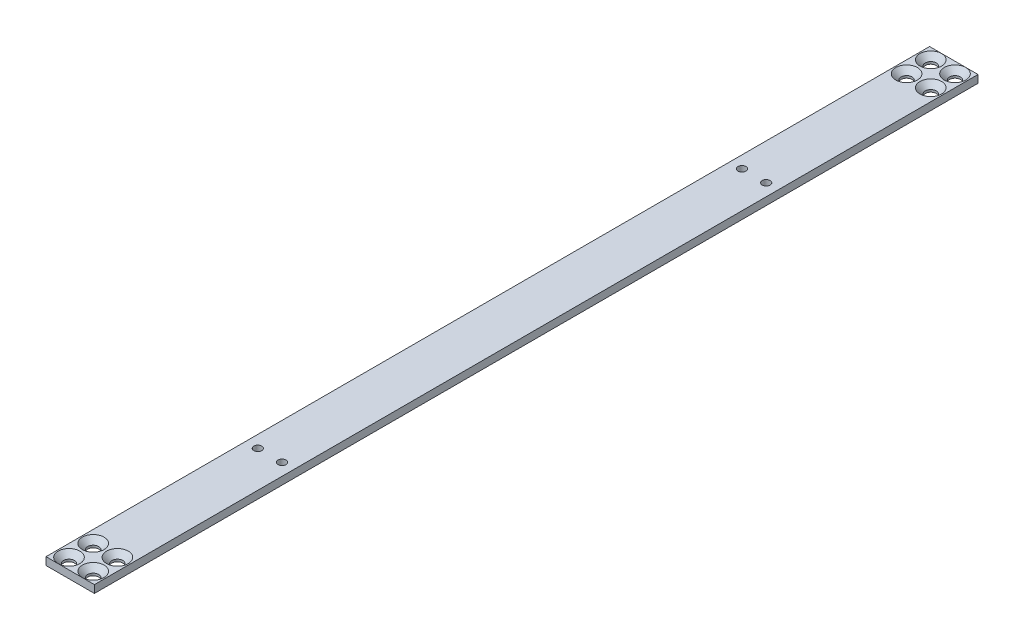
ISO-10303-21;
HEADER;
FILE_DESCRIPTION(('STEP AP214'),'2;1');
FILE_NAME('part.step','',(''),(''),'','','');
FILE_SCHEMA(('AUTOMOTIVE_DESIGN { 1 0 10303 214 1 1 1 1 }'));
ENDSEC;
DATA;
#1=APPLICATION_CONTEXT('core data for automotive mechanical design processes');
#2=APPLICATION_PROTOCOL_DEFINITION('international standard','automotive_design',2000,#1);
#3=PRODUCT_CONTEXT('',#1,'mechanical');
#4=PRODUCT('Part','Part','',(#3));
#5=PRODUCT_RELATED_PRODUCT_CATEGORY('part','',(#4));
#6=PRODUCT_DEFINITION_FORMATION('','',#4);
#7=PRODUCT_DEFINITION_CONTEXT('part definition',#1,'design');
#8=PRODUCT_DEFINITION('design','',#6,#7);
#9=PRODUCT_DEFINITION_SHAPE('','',#8);
#10=(LENGTH_UNIT() NAMED_UNIT(*) SI_UNIT(.MILLI.,.METRE.));
#11=(NAMED_UNIT(*) PLANE_ANGLE_UNIT() SI_UNIT($,.RADIAN.));
#12=(NAMED_UNIT(*) SI_UNIT($,.STERADIAN.) SOLID_ANGLE_UNIT());
#13=UNCERTAINTY_MEASURE_WITH_UNIT(LENGTH_MEASURE(1.E-05),#10,'distance_accuracy_value','');
#14=(GEOMETRIC_REPRESENTATION_CONTEXT(3) GLOBAL_UNCERTAINTY_ASSIGNED_CONTEXT((#13)) GLOBAL_UNIT_ASSIGNED_CONTEXT((#10,
#11,#12)) REPRESENTATION_CONTEXT('',''));
#15=CARTESIAN_POINT('',(0.,0.,0.));
#16=DIRECTION('',(0.,0.,1.));
#17=DIRECTION('',(1.,0.,0.));
#18=AXIS2_PLACEMENT_3D('',#15,#16,#17);
#19=CARTESIAN_POINT('',(10.,3.175,182.5));
#20=DIRECTION('',(-1.,0.,0.));
#21=DIRECTION('',(0.,0.,1.));
#22=AXIS2_PLACEMENT_3D('',#19,#20,#21);
#23=PLANE('',#22);
#24=DIRECTION('',(0.,0.,-1.));
#25=VECTOR('',#24,1.);
#26=CARTESIAN_POINT('',(10.,0.,182.5));
#27=LINE('',#26,#25);
#28=CARTESIAN_POINT('',(10.,0.,182.5));
#29=VERTEX_POINT('',#28);
#30=CARTESIAN_POINT('',(10.,0.,-182.5));
#31=VERTEX_POINT('',#30);
#32=EDGE_CURVE('E111',#29,#31,#27,.T.);
#33=ORIENTED_EDGE('',*,*,#32,.T.);
#34=DIRECTION('',(0.,-1.,0.));
#35=VECTOR('',#34,1.);
#36=CARTESIAN_POINT('',(10.,3.175,-182.5));
#37=LINE('',#36,#35);
#38=CARTESIAN_POINT('',(10.,3.175,-182.5));
#39=VERTEX_POINT('',#38);
#40=EDGE_CURVE('E11',#39,#31,#37,.T.);
#41=ORIENTED_EDGE('',*,*,#40,.F.);
#42=DIRECTION('',(0.,0.,-1.));
#43=VECTOR('',#42,1.);
#44=CARTESIAN_POINT('',(10.,3.175,182.5));
#45=LINE('',#44,#43);
#46=CARTESIAN_POINT('',(10.,3.175,182.5));
#47=VERTEX_POINT('',#46);
#48=EDGE_CURVE('E95',#47,#39,#45,.T.);
#49=ORIENTED_EDGE('',*,*,#48,.F.);
#50=DIRECTION('',(0.,-1.,0.));
#51=VECTOR('',#50,1.);
#52=CARTESIAN_POINT('',(10.,3.175,182.5));
#53=LINE('',#52,#51);
#54=EDGE_CURVE('E107',#47,#29,#53,.T.);
#55=ORIENTED_EDGE('',*,*,#54,.T.);
#56=EDGE_LOOP('',(#33,#41,#49,#55));
#57=FACE_BOUND('',#56,.T.);
#58=ADVANCED_FACE('F43',(#57),#23,.F.);
#59=CARTESIAN_POINT('',(-10.,3.175,-182.5));
#60=DIRECTION('',(0.,0.,1.));
#61=DIRECTION('',(1.,0.,0.));
#62=AXIS2_PLACEMENT_3D('',#59,#60,#61);
#63=PLANE('',#62);
#64=DIRECTION('',(-1.,0.,0.));
#65=VECTOR('',#64,1.);
#66=CARTESIAN_POINT('',(-10.,0.,-182.5));
#67=LINE('',#66,#65);
#68=CARTESIAN_POINT('',(-10.,0.,-182.5));
#69=VERTEX_POINT('',#68);
#70=EDGE_CURVE('E100',#31,#69,#67,.T.);
#71=ORIENTED_EDGE('',*,*,#70,.T.);
#72=DIRECTION('',(0.,-1.,0.));
#73=VECTOR('',#72,1.);
#74=CARTESIAN_POINT('',(-10.,3.175,-182.5));
#75=LINE('',#74,#73);
#76=CARTESIAN_POINT('',(-10.,3.175,-182.5));
#77=VERTEX_POINT('',#76);
#78=EDGE_CURVE('E52',#77,#69,#75,.T.);
#79=ORIENTED_EDGE('',*,*,#78,.F.);
#80=DIRECTION('',(-1.,0.,0.));
#81=VECTOR('',#80,1.);
#82=CARTESIAN_POINT('',(-10.,3.175,-182.5));
#83=LINE('',#82,#81);
#84=EDGE_CURVE('E90',#39,#77,#83,.T.);
#85=ORIENTED_EDGE('',*,*,#84,.F.);
#86=ORIENTED_EDGE('',*,*,#40,.T.);
#87=EDGE_LOOP('',(#71,#79,#85,#86));
#88=FACE_BOUND('',#87,.T.);
#89=ADVANCED_FACE('F99',(#88),#63,.F.);
#90=CARTESIAN_POINT('',(-10.,3.175,182.5));
#91=DIRECTION('',(1.,0.,0.));
#92=DIRECTION('',(0.,0.,-1.));
#93=AXIS2_PLACEMENT_3D('',#90,#91,#92);
#94=PLANE('',#93);
#95=DIRECTION('',(0.,0.,1.));
#96=VECTOR('',#95,1.);
#97=CARTESIAN_POINT('',(-10.,0.,182.5));
#98=LINE('',#97,#96);
#99=CARTESIAN_POINT('',(-10.,0.,182.5));
#100=VERTEX_POINT('',#99);
#101=EDGE_CURVE('E77',#69,#100,#98,.T.);
#102=ORIENTED_EDGE('',*,*,#101,.T.);
#103=DIRECTION('',(0.,-1.,0.));
#104=VECTOR('',#103,1.);
#105=CARTESIAN_POINT('',(-10.,3.175,182.5));
#106=LINE('',#105,#104);
#107=CARTESIAN_POINT('',(-10.,3.175,182.5));
#108=VERTEX_POINT('',#107);
#109=EDGE_CURVE('E102',#108,#100,#106,.T.);
#110=ORIENTED_EDGE('',*,*,#109,.F.);
#111=DIRECTION('',(0.,0.,1.));
#112=VECTOR('',#111,1.);
#113=CARTESIAN_POINT('',(-10.,3.175,182.5));
#114=LINE('',#113,#112);
#115=EDGE_CURVE('E93',#77,#108,#114,.T.);
#116=ORIENTED_EDGE('',*,*,#115,.F.);
#117=ORIENTED_EDGE('',*,*,#78,.T.);
#118=EDGE_LOOP('',(#102,#110,#116,#117));
#119=FACE_BOUND('',#118,.T.);
#120=ADVANCED_FACE('F103',(#119),#94,.F.);
#121=CARTESIAN_POINT('',(-10.,3.175,182.5));
#122=DIRECTION('',(0.,0.,-1.));
#123=DIRECTION('',(-1.,0.,0.));
#124=AXIS2_PLACEMENT_3D('',#121,#122,#123);
#125=PLANE('',#124);
#126=DIRECTION('',(1.,0.,0.));
#127=VECTOR('',#126,1.);
#128=CARTESIAN_POINT('',(-10.,0.,182.5));
#129=LINE('',#128,#127);
#130=EDGE_CURVE('E83',#100,#29,#129,.T.);
#131=ORIENTED_EDGE('',*,*,#130,.T.);
#132=ORIENTED_EDGE('',*,*,#54,.F.);
#133=DIRECTION('',(1.,0.,0.));
#134=VECTOR('',#133,1.);
#135=CARTESIAN_POINT('',(-10.,3.175,182.5));
#136=LINE('',#135,#134);
#137=EDGE_CURVE('E60',#108,#47,#136,.T.);
#138=ORIENTED_EDGE('',*,*,#137,.F.);
#139=ORIENTED_EDGE('',*,*,#109,.T.);
#140=EDGE_LOOP('',(#131,#132,#138,#139));
#141=FACE_BOUND('',#140,.T.);
#142=ADVANCED_FACE('F125',(#141),#125,.F.);
#143=CARTESIAN_POINT('',(0.,3.175,0.));
#144=DIRECTION('',(0.,-1.,0.));
#145=DIRECTION('',(0.,0.,-1.));
#146=AXIS2_PLACEMENT_3D('',#143,#144,#145);
#147=PLANE('',#146);
#148=CARTESIAN_POINT('',(-5.,3.175,100.));
#149=DIRECTION('',(0.,1.,0.));
#150=DIRECTION('',(0.,0.,1.));
#151=AXIS2_PLACEMENT_3D('',#148,#149,#150);
#152=CIRCLE('',#151,1.65);
#153=CARTESIAN_POINT('',(-5.,3.175,101.65));
#154=VERTEX_POINT('',#153);
#155=EDGE_CURVE('E255',#154,#154,#152,.T.);
#156=ORIENTED_EDGE('',*,*,#155,.F.);
#157=EDGE_LOOP('',(#156));
#158=FACE_BOUND('',#157,.T.);
#159=CARTESIAN_POINT('',(-5.,3.175,-100.));
#160=DIRECTION('',(0.,1.,0.));
#161=DIRECTION('',(0.,0.,1.));
#162=AXIS2_PLACEMENT_3D('',#159,#160,#161);
#163=CIRCLE('',#162,1.65);
#164=CARTESIAN_POINT('',(-5.,3.175,-98.35));
#165=VERTEX_POINT('',#164);
#166=EDGE_CURVE('E247',#165,#165,#163,.T.);
#167=ORIENTED_EDGE('',*,*,#166,.F.);
#168=EDGE_LOOP('',(#167));
#169=FACE_BOUND('',#168,.T.);
#170=CARTESIAN_POINT('',(5.,3.175,-100.));
#171=DIRECTION('',(0.,1.,0.));
#172=DIRECTION('',(0.,0.,1.));
#173=AXIS2_PLACEMENT_3D('',#170,#171,#172);
#174=CIRCLE('',#173,1.65);
#175=CARTESIAN_POINT('',(5.,3.175,-98.35));
#176=VERTEX_POINT('',#175);
#177=EDGE_CURVE('E239',#176,#176,#174,.T.);
#178=ORIENTED_EDGE('',*,*,#177,.F.);
#179=EDGE_LOOP('',(#178));
#180=FACE_BOUND('',#179,.T.);
#181=CARTESIAN_POINT('',(5.,3.175,100.));
#182=DIRECTION('',(0.,1.,0.));
#183=DIRECTION('',(0.,0.,1.));
#184=AXIS2_PLACEMENT_3D('',#181,#182,#183);
#185=CIRCLE('',#184,1.65);
#186=CARTESIAN_POINT('',(5.,3.175,101.65));
#187=VERTEX_POINT('',#186);
#188=EDGE_CURVE('E231',#187,#187,#185,.T.);
#189=ORIENTED_EDGE('',*,*,#188,.F.);
#190=EDGE_LOOP('',(#189));
#191=FACE_BOUND('',#190,.T.);
#192=CARTESIAN_POINT('',(5.,3.175,168.));
#193=DIRECTION('',(0.,1.,0.));
#194=DIRECTION('',(0.,0.,1.));
#195=AXIS2_PLACEMENT_3D('',#192,#193,#194);
#196=CIRCLE('',#195,4.48);
#197=CARTESIAN_POINT('',(5.,3.175,172.48));
#198=VERTEX_POINT('',#197);
#199=EDGE_CURVE('E223',#198,#198,#196,.T.);
#200=ORIENTED_EDGE('',*,*,#199,.F.);
#201=EDGE_LOOP('',(#200));
#202=FACE_BOUND('',#201,.T.);
#203=CARTESIAN_POINT('',(-5.00000000000001,3.175,178.));
#204=DIRECTION('',(0.,1.,0.));
#205=DIRECTION('',(0.,0.,1.));
#206=AXIS2_PLACEMENT_3D('',#203,#204,#205);
#207=CIRCLE('',#206,4.48);
#208=CARTESIAN_POINT('',(-5.00000000000001,3.175,182.48));
#209=VERTEX_POINT('',#208);
#210=EDGE_CURVE('E211',#209,#209,#207,.T.);
#211=ORIENTED_EDGE('',*,*,#210,.F.);
#212=EDGE_LOOP('',(#211));
#213=FACE_BOUND('',#212,.T.);
#214=CARTESIAN_POINT('',(-5.00000000000001,3.175,168.));
#215=DIRECTION('',(0.,1.,0.));
#216=DIRECTION('',(0.,0.,1.));
#217=AXIS2_PLACEMENT_3D('',#214,#215,#216);
#218=CIRCLE('',#217,4.48);
#219=CARTESIAN_POINT('',(-5.00000000000001,3.175,172.48));
#220=VERTEX_POINT('',#219);
#221=EDGE_CURVE('E199',#220,#220,#218,.T.);
#222=ORIENTED_EDGE('',*,*,#221,.F.);
#223=EDGE_LOOP('',(#222));
#224=FACE_BOUND('',#223,.T.);
#225=CARTESIAN_POINT('',(5.,3.175,178.));
#226=DIRECTION('',(0.,1.,0.));
#227=DIRECTION('',(0.,0.,1.));
#228=AXIS2_PLACEMENT_3D('',#225,#226,#227);
#229=CIRCLE('',#228,4.48);
#230=CARTESIAN_POINT('',(5.,3.175,182.48));
#231=VERTEX_POINT('',#230);
#232=EDGE_CURVE('E187',#231,#231,#229,.T.);
#233=ORIENTED_EDGE('',*,*,#232,.F.);
#234=EDGE_LOOP('',(#233));
#235=FACE_BOUND('',#234,.T.);
#236=CARTESIAN_POINT('',(5.,3.175,-178.));
#237=DIRECTION('',(0.,1.,0.));
#238=DIRECTION('',(0.,0.,1.));
#239=AXIS2_PLACEMENT_3D('',#236,#237,#238);
#240=CIRCLE('',#239,4.48);
#241=CARTESIAN_POINT('',(5.,3.175,-173.52));
#242=VERTEX_POINT('',#241);
#243=EDGE_CURVE('E175',#242,#242,#240,.T.);
#244=ORIENTED_EDGE('',*,*,#243,.F.);
#245=EDGE_LOOP('',(#244));
#246=FACE_BOUND('',#245,.T.);
#247=CARTESIAN_POINT('',(-5.00000000000001,3.175,-168.));
#248=DIRECTION('',(0.,1.,0.));
#249=DIRECTION('',(0.,0.,1.));
#250=AXIS2_PLACEMENT_3D('',#247,#248,#249);
#251=CIRCLE('',#250,4.48);
#252=CARTESIAN_POINT('',(-5.00000000000001,3.175,-163.52));
#253=VERTEX_POINT('',#252);
#254=EDGE_CURVE('E163',#253,#253,#251,.T.);
#255=ORIENTED_EDGE('',*,*,#254,.F.);
#256=EDGE_LOOP('',(#255));
#257=FACE_BOUND('',#256,.T.);
#258=CARTESIAN_POINT('',(-5.00000000000001,3.175,-178.));
#259=DIRECTION('',(0.,1.,0.));
#260=DIRECTION('',(0.,0.,1.));
#261=AXIS2_PLACEMENT_3D('',#258,#259,#260);
#262=CIRCLE('',#261,4.48);
#263=CARTESIAN_POINT('',(-5.00000000000001,3.175,-173.52));
#264=VERTEX_POINT('',#263);
#265=EDGE_CURVE('E151',#264,#264,#262,.T.);
#266=ORIENTED_EDGE('',*,*,#265,.F.);
#267=EDGE_LOOP('',(#266));
#268=FACE_BOUND('',#267,.T.);
#269=CARTESIAN_POINT('',(5.,3.175,-168.));
#270=DIRECTION('',(0.,1.,0.));
#271=DIRECTION('',(0.,0.,1.));
#272=AXIS2_PLACEMENT_3D('',#269,#270,#271);
#273=CIRCLE('',#272,4.48);
#274=CARTESIAN_POINT('',(5.,3.175,-163.52));
#275=VERTEX_POINT('',#274);
#276=EDGE_CURVE('E139',#275,#275,#273,.T.);
#277=ORIENTED_EDGE('',*,*,#276,.F.);
#278=EDGE_LOOP('',(#277));
#279=FACE_BOUND('',#278,.T.);
#280=ORIENTED_EDGE('',*,*,#48,.T.);
#281=ORIENTED_EDGE('',*,*,#84,.T.);
#282=ORIENTED_EDGE('',*,*,#115,.T.);
#283=ORIENTED_EDGE('',*,*,#137,.T.);
#284=EDGE_LOOP('',(#280,#281,#282,#283));
#285=FACE_BOUND('',#284,.T.);
#286=ADVANCED_FACE('F91',(#158,#169,#180,#191,#202,#213,#224,#235,#246,#257,#268,#279,#285),
#147,.F.);
#287=CARTESIAN_POINT('',(0.,0.,0.));
#288=DIRECTION('',(0.,-1.,0.));
#289=DIRECTION('',(0.,0.,-1.));
#290=AXIS2_PLACEMENT_3D('',#287,#288,#289);
#291=PLANE('',#290);
#292=CARTESIAN_POINT('',(-5.,0.,100.));
#293=DIRECTION('',(0.,1.,0.));
#294=DIRECTION('',(0.,0.,1.));
#295=AXIS2_PLACEMENT_3D('',#292,#293,#294);
#296=CIRCLE('',#295,1.65);
#297=CARTESIAN_POINT('',(-5.,0.,101.65));
#298=VERTEX_POINT('',#297);
#299=EDGE_CURVE('E251',#298,#298,#296,.T.);
#300=ORIENTED_EDGE('',*,*,#299,.T.);
#301=EDGE_LOOP('',(#300));
#302=FACE_BOUND('',#301,.T.);
#303=CARTESIAN_POINT('',(-5.,0.,-100.));
#304=DIRECTION('',(0.,1.,0.));
#305=DIRECTION('',(0.,0.,1.));
#306=AXIS2_PLACEMENT_3D('',#303,#304,#305);
#307=CIRCLE('',#306,1.65);
#308=CARTESIAN_POINT('',(-5.,0.,-98.35));
#309=VERTEX_POINT('',#308);
#310=EDGE_CURVE('E243',#309,#309,#307,.T.);
#311=ORIENTED_EDGE('',*,*,#310,.T.);
#312=EDGE_LOOP('',(#311));
#313=FACE_BOUND('',#312,.T.);
#314=CARTESIAN_POINT('',(5.,0.,-100.));
#315=DIRECTION('',(0.,1.,0.));
#316=DIRECTION('',(0.,0.,1.));
#317=AXIS2_PLACEMENT_3D('',#314,#315,#316);
#318=CIRCLE('',#317,1.65);
#319=CARTESIAN_POINT('',(5.,0.,-98.35));
#320=VERTEX_POINT('',#319);
#321=EDGE_CURVE('E235',#320,#320,#318,.T.);
#322=ORIENTED_EDGE('',*,*,#321,.T.);
#323=EDGE_LOOP('',(#322));
#324=FACE_BOUND('',#323,.T.);
#325=CARTESIAN_POINT('',(5.,0.,100.));
#326=DIRECTION('',(0.,1.,0.));
#327=DIRECTION('',(0.,0.,1.));
#328=AXIS2_PLACEMENT_3D('',#325,#326,#327);
#329=CIRCLE('',#328,1.65);
#330=CARTESIAN_POINT('',(5.,0.,101.65));
#331=VERTEX_POINT('',#330);
#332=EDGE_CURVE('E227',#331,#331,#329,.T.);
#333=ORIENTED_EDGE('',*,*,#332,.T.);
#334=EDGE_LOOP('',(#333));
#335=FACE_BOUND('',#334,.T.);
#336=CARTESIAN_POINT('',(5.,0.,168.));
#337=DIRECTION('',(0.,1.,0.));
#338=DIRECTION('',(0.,0.,1.));
#339=AXIS2_PLACEMENT_3D('',#336,#337,#338);
#340=CIRCLE('',#339,2.25);
#341=CARTESIAN_POINT('',(5.,0.,170.25));
#342=VERTEX_POINT('',#341);
#343=EDGE_CURVE('E215',#342,#342,#340,.T.);
#344=ORIENTED_EDGE('',*,*,#343,.T.);
#345=EDGE_LOOP('',(#344));
#346=FACE_BOUND('',#345,.T.);
#347=CARTESIAN_POINT('',(-5.00000000000001,0.,178.));
#348=DIRECTION('',(0.,1.,0.));
#349=DIRECTION('',(0.,0.,1.));
#350=AXIS2_PLACEMENT_3D('',#347,#348,#349);
#351=CIRCLE('',#350,2.25);
#352=CARTESIAN_POINT('',(-5.00000000000001,0.,180.25));
#353=VERTEX_POINT('',#352);
#354=EDGE_CURVE('E203',#353,#353,#351,.T.);
#355=ORIENTED_EDGE('',*,*,#354,.T.);
#356=EDGE_LOOP('',(#355));
#357=FACE_BOUND('',#356,.T.);
#358=CARTESIAN_POINT('',(-5.00000000000001,0.,168.));
#359=DIRECTION('',(0.,1.,0.));
#360=DIRECTION('',(0.,0.,1.));
#361=AXIS2_PLACEMENT_3D('',#358,#359,#360);
#362=CIRCLE('',#361,2.25);
#363=CARTESIAN_POINT('',(-5.00000000000001,0.,170.25));
#364=VERTEX_POINT('',#363);
#365=EDGE_CURVE('E191',#364,#364,#362,.T.);
#366=ORIENTED_EDGE('',*,*,#365,.T.);
#367=EDGE_LOOP('',(#366));
#368=FACE_BOUND('',#367,.T.);
#369=CARTESIAN_POINT('',(5.,0.,178.));
#370=DIRECTION('',(0.,1.,0.));
#371=DIRECTION('',(0.,0.,1.));
#372=AXIS2_PLACEMENT_3D('',#369,#370,#371);
#373=CIRCLE('',#372,2.25);
#374=CARTESIAN_POINT('',(5.,0.,180.25));
#375=VERTEX_POINT('',#374);
#376=EDGE_CURVE('E179',#375,#375,#373,.T.);
#377=ORIENTED_EDGE('',*,*,#376,.T.);
#378=EDGE_LOOP('',(#377));
#379=FACE_BOUND('',#378,.T.);
#380=CARTESIAN_POINT('',(5.,0.,-178.));
#381=DIRECTION('',(0.,1.,0.));
#382=DIRECTION('',(0.,0.,1.));
#383=AXIS2_PLACEMENT_3D('',#380,#381,#382);
#384=CIRCLE('',#383,2.25);
#385=CARTESIAN_POINT('',(5.,0.,-175.75));
#386=VERTEX_POINT('',#385);
#387=EDGE_CURVE('E167',#386,#386,#384,.T.);
#388=ORIENTED_EDGE('',*,*,#387,.T.);
#389=EDGE_LOOP('',(#388));
#390=FACE_BOUND('',#389,.T.);
#391=CARTESIAN_POINT('',(-5.00000000000001,0.,-168.));
#392=DIRECTION('',(0.,1.,0.));
#393=DIRECTION('',(0.,0.,1.));
#394=AXIS2_PLACEMENT_3D('',#391,#392,#393);
#395=CIRCLE('',#394,2.25);
#396=CARTESIAN_POINT('',(-5.00000000000001,0.,-165.75));
#397=VERTEX_POINT('',#396);
#398=EDGE_CURVE('E155',#397,#397,#395,.T.);
#399=ORIENTED_EDGE('',*,*,#398,.T.);
#400=EDGE_LOOP('',(#399));
#401=FACE_BOUND('',#400,.T.);
#402=CARTESIAN_POINT('',(-5.00000000000001,0.,-178.));
#403=DIRECTION('',(0.,1.,0.));
#404=DIRECTION('',(0.,0.,1.));
#405=AXIS2_PLACEMENT_3D('',#402,#403,#404);
#406=CIRCLE('',#405,2.25);
#407=CARTESIAN_POINT('',(-5.00000000000001,0.,-175.75));
#408=VERTEX_POINT('',#407);
#409=EDGE_CURVE('E143',#408,#408,#406,.T.);
#410=ORIENTED_EDGE('',*,*,#409,.T.);
#411=EDGE_LOOP('',(#410));
#412=FACE_BOUND('',#411,.T.);
#413=CARTESIAN_POINT('',(5.,0.,-168.));
#414=DIRECTION('',(0.,1.,0.));
#415=DIRECTION('',(0.,0.,1.));
#416=AXIS2_PLACEMENT_3D('',#413,#414,#415);
#417=CIRCLE('',#416,2.25);
#418=CARTESIAN_POINT('',(5.,0.,-165.75));
#419=VERTEX_POINT('',#418);
#420=EDGE_CURVE('E115',#419,#419,#417,.T.);
#421=ORIENTED_EDGE('',*,*,#420,.T.);
#422=EDGE_LOOP('',(#421));
#423=FACE_BOUND('',#422,.T.);
#424=ORIENTED_EDGE('',*,*,#32,.F.);
#425=ORIENTED_EDGE('',*,*,#130,.F.);
#426=ORIENTED_EDGE('',*,*,#101,.F.);
#427=ORIENTED_EDGE('',*,*,#70,.F.);
#428=EDGE_LOOP('',(#424,#425,#426,#427));
#429=FACE_BOUND('',#428,.T.);
#430=ADVANCED_FACE('F128',(#302,#313,#324,#335,#346,#357,#368,#379,#390,#401,#412,#423,#429),
#291,.T.);
#431=CARTESIAN_POINT('',(5.,3.175,-168.));
#432=DIRECTION('',(0.,1.,0.));
#433=DIRECTION('',(0.,0.,1.));
#434=AXIS2_PLACEMENT_3D('',#431,#432,#433);
#435=CYLINDRICAL_SURFACE('',#434,2.25);
#436=ORIENTED_EDGE('',*,*,#420,.F.);
#437=EDGE_LOOP('',(#436));
#438=FACE_BOUND('',#437,.T.);
#439=CARTESIAN_POINT('',(5.,0.945000000000001,-168.));
#440=DIRECTION('',(0.,1.,0.));
#441=DIRECTION('',(0.,0.,1.));
#442=AXIS2_PLACEMENT_3D('',#439,#440,#441);
#443=CIRCLE('',#442,2.25);
#444=CARTESIAN_POINT('',(5.,0.945000000000001,-165.75));
#445=VERTEX_POINT('',#444);
#446=EDGE_CURVE('E135',#445,#445,#443,.T.);
#447=ORIENTED_EDGE('',*,*,#446,.T.);
#448=EDGE_LOOP('',(#447));
#449=FACE_BOUND('',#448,.T.);
#450=ADVANCED_FACE('F290',(#438,#449),#435,.F.);
#451=CARTESIAN_POINT('',(5.,3.175,-168.));
#452=DIRECTION('',(0.,1.,0.));
#453=DIRECTION('',(0.,0.,1.));
#454=AXIS2_PLACEMENT_3D('',#451,#452,#453);
#455=CONICAL_SURFACE('',#454,4.48,0.785398163397448);
#456=ORIENTED_EDGE('',*,*,#446,.F.);
#457=EDGE_LOOP('',(#456));
#458=FACE_BOUND('',#457,.T.);
#459=ORIENTED_EDGE('',*,*,#276,.T.);
#460=EDGE_LOOP('',(#459));
#461=FACE_BOUND('',#460,.T.);
#462=ADVANCED_FACE('F287',(#458,#461),#455,.F.);
#463=CARTESIAN_POINT('',(-5.00000000000001,3.175,-178.));
#464=DIRECTION('',(0.,1.,0.));
#465=DIRECTION('',(0.,0.,1.));
#466=AXIS2_PLACEMENT_3D('',#463,#464,#465);
#467=CYLINDRICAL_SURFACE('',#466,2.25);
#468=ORIENTED_EDGE('',*,*,#409,.F.);
#469=EDGE_LOOP('',(#468));
#470=FACE_BOUND('',#469,.T.);
#471=CARTESIAN_POINT('',(-5.00000000000001,0.945000000000001,-178.));
#472=DIRECTION('',(0.,1.,0.));
#473=DIRECTION('',(0.,0.,1.));
#474=AXIS2_PLACEMENT_3D('',#471,#472,#473);
#475=CIRCLE('',#474,2.25);
#476=CARTESIAN_POINT('',(-5.00000000000001,0.945000000000001,-175.75));
#477=VERTEX_POINT('',#476);
#478=EDGE_CURVE('E147',#477,#477,#475,.T.);
#479=ORIENTED_EDGE('',*,*,#478,.T.);
#480=EDGE_LOOP('',(#479));
#481=FACE_BOUND('',#480,.T.);
#482=ADVANCED_FACE('F289',(#470,#481),#467,.F.);
#483=CARTESIAN_POINT('',(-5.00000000000001,3.175,-178.));
#484=DIRECTION('',(0.,1.,0.));
#485=DIRECTION('',(0.,0.,1.));
#486=AXIS2_PLACEMENT_3D('',#483,#484,#485);
#487=CONICAL_SURFACE('',#486,4.48,0.785398163397449);
#488=ORIENTED_EDGE('',*,*,#478,.F.);
#489=EDGE_LOOP('',(#488));
#490=FACE_BOUND('',#489,.T.);
#491=ORIENTED_EDGE('',*,*,#265,.T.);
#492=EDGE_LOOP('',(#491));
#493=FACE_BOUND('',#492,.T.);
#494=ADVANCED_FACE('F297',(#490,#493),#487,.F.);
#495=CARTESIAN_POINT('',(-5.00000000000001,3.175,-168.));
#496=DIRECTION('',(0.,1.,0.));
#497=DIRECTION('',(0.,0.,1.));
#498=AXIS2_PLACEMENT_3D('',#495,#496,#497);
#499=CYLINDRICAL_SURFACE('',#498,2.25);
#500=ORIENTED_EDGE('',*,*,#398,.F.);
#501=EDGE_LOOP('',(#500));
#502=FACE_BOUND('',#501,.T.);
#503=CARTESIAN_POINT('',(-5.00000000000001,0.945000000000001,-168.));
#504=DIRECTION('',(0.,1.,0.));
#505=DIRECTION('',(0.,0.,1.));
#506=AXIS2_PLACEMENT_3D('',#503,#504,#505);
#507=CIRCLE('',#506,2.25);
#508=CARTESIAN_POINT('',(-5.00000000000001,0.945000000000001,-165.75));
#509=VERTEX_POINT('',#508);
#510=EDGE_CURVE('E159',#509,#509,#507,.T.);
#511=ORIENTED_EDGE('',*,*,#510,.T.);
#512=EDGE_LOOP('',(#511));
#513=FACE_BOUND('',#512,.T.);
#514=ADVANCED_FACE('F347',(#502,#513),#499,.F.);
#515=CARTESIAN_POINT('',(-5.00000000000001,3.175,-168.));
#516=DIRECTION('',(0.,1.,0.));
#517=DIRECTION('',(0.,0.,1.));
#518=AXIS2_PLACEMENT_3D('',#515,#516,#517);
#519=CONICAL_SURFACE('',#518,4.48,0.785398163397449);
#520=ORIENTED_EDGE('',*,*,#510,.F.);
#521=EDGE_LOOP('',(#520));
#522=FACE_BOUND('',#521,.T.);
#523=ORIENTED_EDGE('',*,*,#254,.T.);
#524=EDGE_LOOP('',(#523));
#525=FACE_BOUND('',#524,.T.);
#526=ADVANCED_FACE('F352',(#522,#525),#519,.F.);
#527=CARTESIAN_POINT('',(5.,3.175,-178.));
#528=DIRECTION('',(0.,1.,0.));
#529=DIRECTION('',(0.,0.,1.));
#530=AXIS2_PLACEMENT_3D('',#527,#528,#529);
#531=CYLINDRICAL_SURFACE('',#530,2.25);
#532=ORIENTED_EDGE('',*,*,#387,.F.);
#533=EDGE_LOOP('',(#532));
#534=FACE_BOUND('',#533,.T.);
#535=CARTESIAN_POINT('',(5.,0.945000000000001,-178.));
#536=DIRECTION('',(0.,1.,0.));
#537=DIRECTION('',(0.,0.,1.));
#538=AXIS2_PLACEMENT_3D('',#535,#536,#537);
#539=CIRCLE('',#538,2.25);
#540=CARTESIAN_POINT('',(5.,0.945000000000001,-175.75));
#541=VERTEX_POINT('',#540);
#542=EDGE_CURVE('E171',#541,#541,#539,.T.);
#543=ORIENTED_EDGE('',*,*,#542,.T.);
#544=EDGE_LOOP('',(#543));
#545=FACE_BOUND('',#544,.T.);
#546=ADVANCED_FACE('F358',(#534,#545),#531,.F.);
#547=CARTESIAN_POINT('',(5.,3.175,-178.));
#548=DIRECTION('',(0.,1.,0.));
#549=DIRECTION('',(0.,0.,1.));
#550=AXIS2_PLACEMENT_3D('',#547,#548,#549);
#551=CONICAL_SURFACE('',#550,4.48,0.785398163397448);
#552=ORIENTED_EDGE('',*,*,#542,.F.);
#553=EDGE_LOOP('',(#552));
#554=FACE_BOUND('',#553,.T.);
#555=ORIENTED_EDGE('',*,*,#243,.T.);
#556=EDGE_LOOP('',(#555));
#557=FACE_BOUND('',#556,.T.);
#558=ADVANCED_FACE('F362',(#554,#557),#551,.F.);
#559=CARTESIAN_POINT('',(5.,3.175,178.));
#560=DIRECTION('',(0.,1.,0.));
#561=DIRECTION('',(0.,0.,1.));
#562=AXIS2_PLACEMENT_3D('',#559,#560,#561);
#563=CYLINDRICAL_SURFACE('',#562,2.25);
#564=ORIENTED_EDGE('',*,*,#376,.F.);
#565=EDGE_LOOP('',(#564));
#566=FACE_BOUND('',#565,.T.);
#567=CARTESIAN_POINT('',(5.,0.945000000000001,178.));
#568=DIRECTION('',(0.,1.,0.));
#569=DIRECTION('',(0.,0.,1.));
#570=AXIS2_PLACEMENT_3D('',#567,#568,#569);
#571=CIRCLE('',#570,2.25);
#572=CARTESIAN_POINT('',(5.,0.945000000000001,180.25));
#573=VERTEX_POINT('',#572);
#574=EDGE_CURVE('E183',#573,#573,#571,.T.);
#575=ORIENTED_EDGE('',*,*,#574,.T.);
#576=EDGE_LOOP('',(#575));
#577=FACE_BOUND('',#576,.T.);
#578=ADVANCED_FACE('F366',(#566,#577),#563,.F.);
#579=CARTESIAN_POINT('',(5.,3.175,178.));
#580=DIRECTION('',(0.,1.,0.));
#581=DIRECTION('',(0.,0.,1.));
#582=AXIS2_PLACEMENT_3D('',#579,#580,#581);
#583=CONICAL_SURFACE('',#582,4.48,0.785398163397448);
#584=ORIENTED_EDGE('',*,*,#574,.F.);
#585=EDGE_LOOP('',(#584));
#586=FACE_BOUND('',#585,.T.);
#587=ORIENTED_EDGE('',*,*,#232,.T.);
#588=EDGE_LOOP('',(#587));
#589=FACE_BOUND('',#588,.T.);
#590=ADVANCED_FACE('F370',(#586,#589),#583,.F.);
#591=CARTESIAN_POINT('',(-5.00000000000001,3.175,168.));
#592=DIRECTION('',(0.,1.,0.));
#593=DIRECTION('',(0.,0.,1.));
#594=AXIS2_PLACEMENT_3D('',#591,#592,#593);
#595=CYLINDRICAL_SURFACE('',#594,2.25);
#596=ORIENTED_EDGE('',*,*,#365,.F.);
#597=EDGE_LOOP('',(#596));
#598=FACE_BOUND('',#597,.T.);
#599=CARTESIAN_POINT('',(-5.00000000000001,0.945000000000001,168.));
#600=DIRECTION('',(0.,1.,0.));
#601=DIRECTION('',(0.,0.,1.));
#602=AXIS2_PLACEMENT_3D('',#599,#600,#601);
#603=CIRCLE('',#602,2.25);
#604=CARTESIAN_POINT('',(-5.00000000000001,0.945000000000001,170.25));
#605=VERTEX_POINT('',#604);
#606=EDGE_CURVE('E195',#605,#605,#603,.T.);
#607=ORIENTED_EDGE('',*,*,#606,.T.);
#608=EDGE_LOOP('',(#607));
#609=FACE_BOUND('',#608,.T.);
#610=ADVANCED_FACE('F374',(#598,#609),#595,.F.);
#611=CARTESIAN_POINT('',(-5.00000000000001,3.175,168.));
#612=DIRECTION('',(0.,1.,0.));
#613=DIRECTION('',(0.,0.,1.));
#614=AXIS2_PLACEMENT_3D('',#611,#612,#613);
#615=CONICAL_SURFACE('',#614,4.48,0.785398163397449);
#616=ORIENTED_EDGE('',*,*,#606,.F.);
#617=EDGE_LOOP('',(#616));
#618=FACE_BOUND('',#617,.T.);
#619=ORIENTED_EDGE('',*,*,#221,.T.);
#620=EDGE_LOOP('',(#619));
#621=FACE_BOUND('',#620,.T.);
#622=ADVANCED_FACE('F378',(#618,#621),#615,.F.);
#623=CARTESIAN_POINT('',(-5.00000000000001,3.175,178.));
#624=DIRECTION('',(0.,1.,0.));
#625=DIRECTION('',(0.,0.,1.));
#626=AXIS2_PLACEMENT_3D('',#623,#624,#625);
#627=CYLINDRICAL_SURFACE('',#626,2.25);
#628=ORIENTED_EDGE('',*,*,#354,.F.);
#629=EDGE_LOOP('',(#628));
#630=FACE_BOUND('',#629,.T.);
#631=CARTESIAN_POINT('',(-5.00000000000001,0.945000000000001,178.));
#632=DIRECTION('',(0.,1.,0.));
#633=DIRECTION('',(0.,0.,1.));
#634=AXIS2_PLACEMENT_3D('',#631,#632,#633);
#635=CIRCLE('',#634,2.25);
#636=CARTESIAN_POINT('',(-5.00000000000001,0.945000000000001,180.25));
#637=VERTEX_POINT('',#636);
#638=EDGE_CURVE('E207',#637,#637,#635,.T.);
#639=ORIENTED_EDGE('',*,*,#638,.T.);
#640=EDGE_LOOP('',(#639));
#641=FACE_BOUND('',#640,.T.);
#642=ADVANCED_FACE('F382',(#630,#641),#627,.F.);
#643=CARTESIAN_POINT('',(-5.00000000000001,3.175,178.));
#644=DIRECTION('',(0.,1.,0.));
#645=DIRECTION('',(0.,0.,1.));
#646=AXIS2_PLACEMENT_3D('',#643,#644,#645);
#647=CONICAL_SURFACE('',#646,4.48,0.785398163397449);
#648=ORIENTED_EDGE('',*,*,#638,.F.);
#649=EDGE_LOOP('',(#648));
#650=FACE_BOUND('',#649,.T.);
#651=ORIENTED_EDGE('',*,*,#210,.T.);
#652=EDGE_LOOP('',(#651));
#653=FACE_BOUND('',#652,.T.);
#654=ADVANCED_FACE('F386',(#650,#653),#647,.F.);
#655=CARTESIAN_POINT('',(5.,3.175,168.));
#656=DIRECTION('',(0.,1.,0.));
#657=DIRECTION('',(0.,0.,1.));
#658=AXIS2_PLACEMENT_3D('',#655,#656,#657);
#659=CYLINDRICAL_SURFACE('',#658,2.25);
#660=ORIENTED_EDGE('',*,*,#343,.F.);
#661=EDGE_LOOP('',(#660));
#662=FACE_BOUND('',#661,.T.);
#663=CARTESIAN_POINT('',(5.,0.945000000000001,168.));
#664=DIRECTION('',(0.,1.,0.));
#665=DIRECTION('',(0.,0.,1.));
#666=AXIS2_PLACEMENT_3D('',#663,#664,#665);
#667=CIRCLE('',#666,2.25);
#668=CARTESIAN_POINT('',(5.,0.945000000000001,170.25));
#669=VERTEX_POINT('',#668);
#670=EDGE_CURVE('E219',#669,#669,#667,.T.);
#671=ORIENTED_EDGE('',*,*,#670,.T.);
#672=EDGE_LOOP('',(#671));
#673=FACE_BOUND('',#672,.T.);
#674=ADVANCED_FACE('F390',(#662,#673),#659,.F.);
#675=CARTESIAN_POINT('',(5.,3.175,168.));
#676=DIRECTION('',(0.,1.,0.));
#677=DIRECTION('',(0.,0.,1.));
#678=AXIS2_PLACEMENT_3D('',#675,#676,#677);
#679=CONICAL_SURFACE('',#678,4.48,0.785398163397448);
#680=ORIENTED_EDGE('',*,*,#670,.F.);
#681=EDGE_LOOP('',(#680));
#682=FACE_BOUND('',#681,.T.);
#683=ORIENTED_EDGE('',*,*,#199,.T.);
#684=EDGE_LOOP('',(#683));
#685=FACE_BOUND('',#684,.T.);
#686=ADVANCED_FACE('F394',(#682,#685),#679,.F.);
#687=CARTESIAN_POINT('',(5.,3.175,100.));
#688=DIRECTION('',(0.,1.,0.));
#689=DIRECTION('',(0.,0.,1.));
#690=AXIS2_PLACEMENT_3D('',#687,#688,#689);
#691=CYLINDRICAL_SURFACE('',#690,1.65);
#692=ORIENTED_EDGE('',*,*,#332,.F.);
#693=EDGE_LOOP('',(#692));
#694=FACE_BOUND('',#693,.T.);
#695=ORIENTED_EDGE('',*,*,#188,.T.);
#696=EDGE_LOOP('',(#695));
#697=FACE_BOUND('',#696,.T.);
#698=ADVANCED_FACE('F398',(#694,#697),#691,.F.);
#699=CARTESIAN_POINT('',(5.,3.175,-100.));
#700=DIRECTION('',(0.,1.,0.));
#701=DIRECTION('',(0.,0.,1.));
#702=AXIS2_PLACEMENT_3D('',#699,#700,#701);
#703=CYLINDRICAL_SURFACE('',#702,1.65);
#704=ORIENTED_EDGE('',*,*,#321,.F.);
#705=EDGE_LOOP('',(#704));
#706=FACE_BOUND('',#705,.T.);
#707=ORIENTED_EDGE('',*,*,#177,.T.);
#708=EDGE_LOOP('',(#707));
#709=FACE_BOUND('',#708,.T.);
#710=ADVANCED_FACE('F402',(#706,#709),#703,.F.);
#711=CARTESIAN_POINT('',(-5.,3.175,-100.));
#712=DIRECTION('',(0.,1.,0.));
#713=DIRECTION('',(0.,0.,1.));
#714=AXIS2_PLACEMENT_3D('',#711,#712,#713);
#715=CYLINDRICAL_SURFACE('',#714,1.65);
#716=ORIENTED_EDGE('',*,*,#310,.F.);
#717=EDGE_LOOP('',(#716));
#718=FACE_BOUND('',#717,.T.);
#719=ORIENTED_EDGE('',*,*,#166,.T.);
#720=EDGE_LOOP('',(#719));
#721=FACE_BOUND('',#720,.T.);
#722=ADVANCED_FACE('F406',(#718,#721),#715,.F.);
#723=CARTESIAN_POINT('',(-5.,3.175,100.));
#724=DIRECTION('',(0.,1.,0.));
#725=DIRECTION('',(0.,0.,1.));
#726=AXIS2_PLACEMENT_3D('',#723,#724,#725);
#727=CYLINDRICAL_SURFACE('',#726,1.65);
#728=ORIENTED_EDGE('',*,*,#299,.F.);
#729=EDGE_LOOP('',(#728));
#730=FACE_BOUND('',#729,.T.);
#731=ORIENTED_EDGE('',*,*,#155,.T.);
#732=EDGE_LOOP('',(#731));
#733=FACE_BOUND('',#732,.T.);
#734=ADVANCED_FACE('F260',(#730,#733),#727,.F.);
#735=CLOSED_SHELL('',(#58,#89,#120,#142,#286,#430,#450,#462,#482,#494,#514,#526,#546,#558,#578,
#590,#610,#622,#642,#654,#674,#686,#698,#710,#722,#734));
#736=MANIFOLD_SOLID_BREP('B2',#735);
#737=ADVANCED_BREP_SHAPE_REPRESENTATION('',(#18,#736),#14);
#738=SHAPE_DEFINITION_REPRESENTATION(#9,#737);
ENDSEC;
END-ISO-10303-21;
